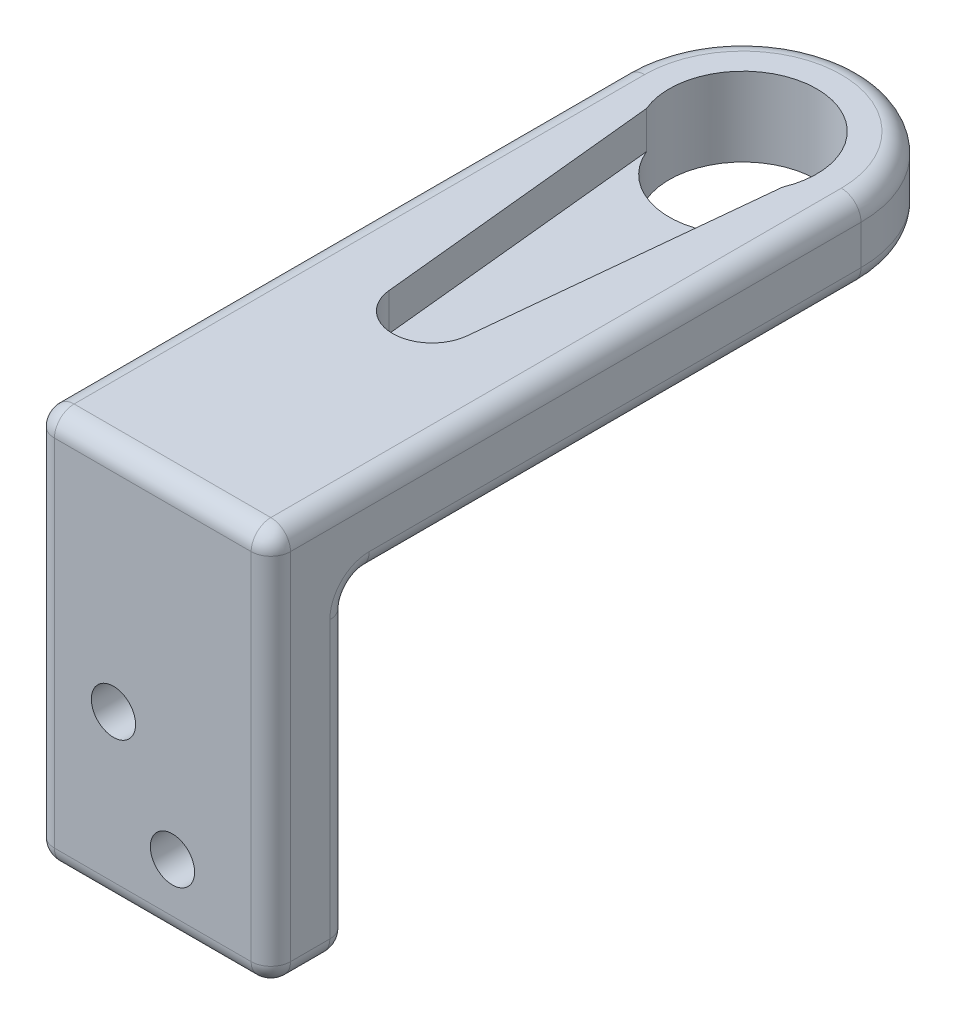
ISO-10303-21;
HEADER;
FILE_DESCRIPTION(('STEP AP214'),'2;1');
FILE_NAME('part.step','',(''),(''),'','','');
FILE_SCHEMA(('AUTOMOTIVE_DESIGN { 1 0 10303 214 1 1 1 1 }'));
ENDSEC;
DATA;
#1=APPLICATION_CONTEXT('core data for automotive mechanical design processes');
#2=APPLICATION_PROTOCOL_DEFINITION('international standard','automotive_design',2000,#1);
#3=PRODUCT_CONTEXT('',#1,'mechanical');
#4=PRODUCT('Part','Part','',(#3));
#5=PRODUCT_RELATED_PRODUCT_CATEGORY('part','',(#4));
#6=PRODUCT_DEFINITION_FORMATION('','',#4);
#7=PRODUCT_DEFINITION_CONTEXT('part definition',#1,'design');
#8=PRODUCT_DEFINITION('design','',#6,#7);
#9=PRODUCT_DEFINITION_SHAPE('','',#8);
#10=(LENGTH_UNIT() NAMED_UNIT(*) SI_UNIT(.MILLI.,.METRE.));
#11=(NAMED_UNIT(*) PLANE_ANGLE_UNIT() SI_UNIT($,.RADIAN.));
#12=(NAMED_UNIT(*) SI_UNIT($,.STERADIAN.) SOLID_ANGLE_UNIT());
#13=UNCERTAINTY_MEASURE_WITH_UNIT(LENGTH_MEASURE(1.E-05),#10,'distance_accuracy_value','');
#14=(GEOMETRIC_REPRESENTATION_CONTEXT(3) GLOBAL_UNCERTAINTY_ASSIGNED_CONTEXT((#13)) GLOBAL_UNIT_ASSIGNED_CONTEXT((#10,
#11,#12)) REPRESENTATION_CONTEXT('',''));
#15=CARTESIAN_POINT('',(0.,0.,0.));
#16=DIRECTION('',(0.,0.,1.));
#17=DIRECTION('',(1.,0.,0.));
#18=AXIS2_PLACEMENT_3D('',#15,#16,#17);
#19=CARTESIAN_POINT('',(0.,4.,0.));
#20=DIRECTION('',(0.,-1.,0.));
#21=DIRECTION('',(0.,0.,-1.));
#22=AXIS2_PLACEMENT_3D('',#19,#20,#21);
#23=CYLINDRICAL_SURFACE('',#22,6.);
#24=DIRECTION('',(0.,-1.,0.));
#25=VECTOR('',#24,1.);
#26=CARTESIAN_POINT('',(-6.,4.,0.));
#27=LINE('',#26,#25);
#28=CARTESIAN_POINT('',(-6.,3.,0.));
#29=VERTEX_POINT('',#28);
#30=CARTESIAN_POINT('',(-6.,1.,0.));
#31=VERTEX_POINT('',#30);
#32=EDGE_CURVE('E234',#29,#31,#27,.T.);
#33=ORIENTED_EDGE('',*,*,#32,.F.);
#34=CARTESIAN_POINT('',(0.,3.,0.));
#35=DIRECTION('',(0.,-1.,0.));
#36=DIRECTION('',(0.,0.,-1.));
#37=AXIS2_PLACEMENT_3D('',#34,#35,#36);
#38=CIRCLE('',#37,6.);
#39=CARTESIAN_POINT('',(6.,3.,0.));
#40=VERTEX_POINT('',#39);
#41=EDGE_CURVE('E306',#29,#40,#38,.T.);
#42=ORIENTED_EDGE('',*,*,#41,.T.);
#43=DIRECTION('',(0.,-1.,0.));
#44=VECTOR('',#43,1.);
#45=CARTESIAN_POINT('',(6.,4.,0.));
#46=LINE('',#45,#44);
#47=CARTESIAN_POINT('',(6.,1.,0.));
#48=VERTEX_POINT('',#47);
#49=EDGE_CURVE('E225',#40,#48,#46,.T.);
#50=ORIENTED_EDGE('',*,*,#49,.T.);
#51=CARTESIAN_POINT('',(0.,1.,0.));
#52=DIRECTION('',(0.,-1.,0.));
#53=DIRECTION('',(0.,0.,-1.));
#54=AXIS2_PLACEMENT_3D('',#51,#52,#53);
#55=CIRCLE('',#54,6.);
#56=EDGE_CURVE('E303',#48,#31,#55,.F.);
#57=ORIENTED_EDGE('',*,*,#56,.T.);
#58=EDGE_LOOP('',(#33,#42,#50,#57));
#59=FACE_BOUND('',#58,.T.);
#60=ADVANCED_FACE('F43',(#59),#23,.T.);
#61=CARTESIAN_POINT('',(-6.,4.,0.));
#62=DIRECTION('',(1.,0.,0.));
#63=DIRECTION('',(0.,0.,-1.));
#64=AXIS2_PLACEMENT_3D('',#61,#62,#63);
#65=PLANE('',#64);
#66=DIRECTION('',(0.,-1.,0.));
#67=VECTOR('',#66,1.);
#68=CARTESIAN_POINT('',(-6.,4.,29.));
#69=LINE('',#68,#67);
#70=CARTESIAN_POINT('',(-6.,-15.05,29.));
#71=VERTEX_POINT('',#70);
#72=CARTESIAN_POINT('',(-6.,3.,29.));
#73=VERTEX_POINT('',#72);
#74=EDGE_CURVE('E284',#71,#73,#69,.F.);
#75=ORIENTED_EDGE('',*,*,#74,.T.);
#76=DIRECTION('',(0.,0.,1.));
#77=VECTOR('',#76,1.);
#78=CARTESIAN_POINT('',(-6.,3.,0.));
#79=LINE('',#78,#77);
#80=EDGE_CURVE('E287',#73,#29,#79,.F.);
#81=ORIENTED_EDGE('',*,*,#80,.T.);
#82=ORIENTED_EDGE('',*,*,#32,.T.);
#83=DIRECTION('',(0.,0.,1.));
#84=VECTOR('',#83,1.);
#85=CARTESIAN_POINT('',(-6.,1.,26.));
#86=LINE('',#85,#84);
#87=CARTESIAN_POINT('',(-6.,1.,25.));
#88=VERTEX_POINT('',#87);
#89=EDGE_CURVE('E275',#31,#88,#86,.T.);
#90=ORIENTED_EDGE('',*,*,#89,.T.);
#91=CARTESIAN_POINT('',(-6.,-1.,25.));
#92=DIRECTION('',(1.,0.,0.));
#93=DIRECTION('',(0.,0.,-1.));
#94=AXIS2_PLACEMENT_3D('',#91,#92,#93);
#95=CIRCLE('',#94,2.);
#96=CARTESIAN_POINT('',(-6.,-1.,27.));
#97=VERTEX_POINT('',#96);
#98=EDGE_CURVE('E271',#97,#88,#95,.F.);
#99=ORIENTED_EDGE('',*,*,#98,.F.);
#100=DIRECTION('',(0.,1.,0.));
#101=VECTOR('',#100,1.);
#102=CARTESIAN_POINT('',(-6.,4.,27.));
#103=LINE('',#102,#101);
#104=CARTESIAN_POINT('',(-6.,-15.05,27.));
#105=VERTEX_POINT('',#104);
#106=EDGE_CURVE('E278',#97,#105,#103,.F.);
#107=ORIENTED_EDGE('',*,*,#106,.T.);
#108=DIRECTION('',(0.,0.,-1.));
#109=VECTOR('',#108,1.);
#110=CARTESIAN_POINT('',(-6.,-15.05,30.));
#111=LINE('',#110,#109);
#112=EDGE_CURVE('E281',#105,#71,#111,.F.);
#113=ORIENTED_EDGE('',*,*,#112,.T.);
#114=EDGE_LOOP('',(#75,#81,#82,#90,#99,#107,#113));
#115=FACE_BOUND('',#114,.T.);
#116=ADVANCED_FACE('F506',(#115),#65,.F.);
#117=CARTESIAN_POINT('',(-6.,4.,30.));
#118=DIRECTION('',(0.,0.,-1.));
#119=DIRECTION('',(-1.,0.,0.));
#120=AXIS2_PLACEMENT_3D('',#117,#118,#119);
#121=PLANE('',#120);
#122=DIRECTION('',(0.,-1.,0.));
#123=VECTOR('',#122,1.);
#124=CARTESIAN_POINT('',(5.,4.,30.));
#125=LINE('',#124,#123);
#126=CARTESIAN_POINT('',(5.,-15.05,30.));
#127=VERTEX_POINT('',#126);
#128=CARTESIAN_POINT('',(5.,3.,30.));
#129=VERTEX_POINT('',#128);
#130=EDGE_CURVE('E328',#127,#129,#125,.F.);
#131=ORIENTED_EDGE('',*,*,#130,.T.);
#132=DIRECTION('',(1.,0.,0.));
#133=VECTOR('',#132,1.);
#134=CARTESIAN_POINT('',(-6.,3.,30.));
#135=LINE('',#134,#133);
#136=CARTESIAN_POINT('',(-5.,3.,30.));
#137=VERTEX_POINT('',#136);
#138=EDGE_CURVE('E331',#129,#137,#135,.F.);
#139=ORIENTED_EDGE('',*,*,#138,.T.);
#140=DIRECTION('',(0.,-1.,0.));
#141=VECTOR('',#140,1.);
#142=CARTESIAN_POINT('',(-5.,4.,30.));
#143=LINE('',#142,#141);
#144=CARTESIAN_POINT('',(-5.,-15.05,30.));
#145=VERTEX_POINT('',#144);
#146=EDGE_CURVE('E325',#137,#145,#143,.T.);
#147=ORIENTED_EDGE('',*,*,#146,.T.);
#148=DIRECTION('',(-1.,0.,0.));
#149=VECTOR('',#148,1.);
#150=CARTESIAN_POINT('',(6.,-15.05,30.));
#151=LINE('',#150,#149);
#152=EDGE_CURVE('E322',#145,#127,#151,.F.);
#153=ORIENTED_EDGE('',*,*,#152,.T.);
#154=EDGE_LOOP('',(#131,#139,#147,#153));
#155=FACE_BOUND('',#154,.T.);
#156=CARTESIAN_POINT('',(1.,-12.55,30.));
#157=DIRECTION('',(0.,0.,-1.));
#158=DIRECTION('',(-1.,0.,0.));
#159=AXIS2_PLACEMENT_3D('',#156,#157,#158);
#160=CIRCLE('',#159,1.125);
#161=CARTESIAN_POINT('',(-0.124999999999997,-12.55,30.));
#162=VERTEX_POINT('',#161);
#163=EDGE_CURVE('E466',#162,#162,#160,.F.);
#164=ORIENTED_EDGE('',*,*,#163,.F.);
#165=EDGE_LOOP('',(#164));
#166=FACE_BOUND('',#165,.T.);
#167=CARTESIAN_POINT('',(-2.,-7.55,30.));
#168=DIRECTION('',(0.,0.,-1.));
#169=DIRECTION('',(-1.,0.,0.));
#170=AXIS2_PLACEMENT_3D('',#167,#168,#169);
#171=CIRCLE('',#170,1.12500000000001);
#172=CARTESIAN_POINT('',(-3.125,-7.55,30.));
#173=VERTEX_POINT('',#172);
#174=EDGE_CURVE('E450',#173,#173,#171,.F.);
#175=ORIENTED_EDGE('',*,*,#174,.F.);
#176=EDGE_LOOP('',(#175));
#177=FACE_BOUND('',#176,.T.);
#178=ADVANCED_FACE('F501',(#155,#166,#177),#121,.F.);
#179=CARTESIAN_POINT('',(6.,4.,30.));
#180=DIRECTION('',(-1.,0.,0.));
#181=DIRECTION('',(0.,0.,1.));
#182=AXIS2_PLACEMENT_3D('',#179,#180,#181);
#183=PLANE('',#182);
#184=CARTESIAN_POINT('',(6.,-1.,25.));
#185=DIRECTION('',(-1.,0.,0.));
#186=DIRECTION('',(0.,0.,1.));
#187=AXIS2_PLACEMENT_3D('',#184,#185,#186);
#188=CIRCLE('',#187,2.);
#189=CARTESIAN_POINT('',(6.,1.,25.));
#190=VERTEX_POINT('',#189);
#191=CARTESIAN_POINT('',(6.,-1.,27.));
#192=VERTEX_POINT('',#191);
#193=EDGE_CURVE('E251',#190,#192,#188,.F.);
#194=ORIENTED_EDGE('',*,*,#193,.F.);
#195=DIRECTION('',(0.,0.,-1.));
#196=VECTOR('',#195,1.);
#197=CARTESIAN_POINT('',(6.,1.,0.));
#198=LINE('',#197,#196);
#199=EDGE_CURVE('E255',#190,#48,#198,.T.);
#200=ORIENTED_EDGE('',*,*,#199,.T.);
#201=ORIENTED_EDGE('',*,*,#49,.F.);
#202=DIRECTION('',(0.,0.,-1.));
#203=VECTOR('',#202,1.);
#204=CARTESIAN_POINT('',(6.,3.,30.));
#205=LINE('',#204,#203);
#206=CARTESIAN_POINT('',(6.,3.,29.));
#207=VERTEX_POINT('',#206);
#208=EDGE_CURVE('E244',#40,#207,#205,.F.);
#209=ORIENTED_EDGE('',*,*,#208,.T.);
#210=DIRECTION('',(0.,-1.,0.));
#211=VECTOR('',#210,1.);
#212=CARTESIAN_POINT('',(6.,4.,29.));
#213=LINE('',#212,#211);
#214=CARTESIAN_POINT('',(6.,-15.05,29.));
#215=VERTEX_POINT('',#214);
#216=EDGE_CURVE('E241',#207,#215,#213,.T.);
#217=ORIENTED_EDGE('',*,*,#216,.T.);
#218=DIRECTION('',(0.,0.,1.));
#219=VECTOR('',#218,1.);
#220=CARTESIAN_POINT('',(6.,-15.05,26.));
#221=LINE('',#220,#219);
#222=CARTESIAN_POINT('',(6.,-15.05,27.));
#223=VERTEX_POINT('',#222);
#224=EDGE_CURVE('E238',#215,#223,#221,.F.);
#225=ORIENTED_EDGE('',*,*,#224,.T.);
#226=DIRECTION('',(0.,1.,0.));
#227=VECTOR('',#226,1.);
#228=CARTESIAN_POINT('',(6.,4.,27.));
#229=LINE('',#228,#227);
#230=EDGE_CURVE('E247',#223,#192,#229,.T.);
#231=ORIENTED_EDGE('',*,*,#230,.T.);
#232=EDGE_LOOP('',(#194,#200,#201,#209,#217,#225,#231));
#233=FACE_BOUND('',#232,.T.);
#234=ADVANCED_FACE('F492',(#233),#183,.F.);
#235=CARTESIAN_POINT('',(0.,4.,0.));
#236=DIRECTION('',(0.,-1.,0.));
#237=DIRECTION('',(0.,0.,-1.));
#238=AXIS2_PLACEMENT_3D('',#235,#236,#237);
#239=PLANE('',#238);
#240=DIRECTION('',(1.,0.,0.));
#241=VECTOR('',#240,1.);
#242=CARTESIAN_POINT('',(0.,4.,29.));
#243=LINE('',#242,#241);
#244=CARTESIAN_POINT('',(-5.,4.,29.));
#245=VERTEX_POINT('',#244);
#246=CARTESIAN_POINT('',(5.,4.,29.));
#247=VERTEX_POINT('',#246);
#248=EDGE_CURVE('E293',#245,#247,#243,.T.);
#249=ORIENTED_EDGE('',*,*,#248,.T.);
#250=DIRECTION('',(0.,0.,-1.));
#251=VECTOR('',#250,1.);
#252=CARTESIAN_POINT('',(5.,4.,0.));
#253=LINE('',#252,#251);
#254=CARTESIAN_POINT('',(5.,4.,0.));
#255=VERTEX_POINT('',#254);
#256=EDGE_CURVE('E299',#247,#255,#253,.T.);
#257=ORIENTED_EDGE('',*,*,#256,.T.);
#258=CARTESIAN_POINT('',(0.,4.,0.));
#259=DIRECTION('',(0.,-1.,0.));
#260=DIRECTION('',(0.,0.,-1.));
#261=AXIS2_PLACEMENT_3D('',#258,#259,#260);
#262=CIRCLE('',#261,5.);
#263=CARTESIAN_POINT('',(-5.,4.,0.));
#264=VERTEX_POINT('',#263);
#265=EDGE_CURVE('E296',#255,#264,#262,.F.);
#266=ORIENTED_EDGE('',*,*,#265,.T.);
#267=DIRECTION('',(0.,0.,1.));
#268=VECTOR('',#267,1.);
#269=CARTESIAN_POINT('',(-5.,4.,0.));
#270=LINE('',#269,#268);
#271=EDGE_CURVE('E290',#264,#245,#270,.T.);
#272=ORIENTED_EDGE('',*,*,#271,.T.);
#273=EDGE_LOOP('',(#249,#257,#266,#272));
#274=FACE_BOUND('',#273,.T.);
#275=CARTESIAN_POINT('',(0.,4.,0.));
#276=DIRECTION('',(0.,1.,0.));
#277=DIRECTION('',(0.,0.,1.));
#278=AXIS2_PLACEMENT_3D('',#275,#276,#277);
#279=CIRCLE('',#278,3.75);
#280=CARTESIAN_POINT('',(3.45999999999994,4.,1.4459944674861));
#281=VERTEX_POINT('',#280);
#282=CARTESIAN_POINT('',(-3.46,4.,1.44599446748596));
#283=VERTEX_POINT('',#282);
#284=EDGE_CURVE('E213',#281,#283,#279,.T.);
#285=ORIENTED_EDGE('',*,*,#284,.F.);
#286=DIRECTION('',(0.1004588297189,0.,-0.994941216118575));
#287=VECTOR('',#286,1.);
#288=CARTESIAN_POINT('',(3.45999999999994,4.,1.4459944674861));
#289=LINE('',#288,#287);
#290=CARTESIAN_POINT('',(1.98988243223717,4.,16.0059944674861));
#291=VERTEX_POINT('',#290);
#292=EDGE_CURVE('E208',#291,#281,#289,.T.);
#293=ORIENTED_EDGE('',*,*,#292,.F.);
#294=CARTESIAN_POINT('',(0.,4.,15.8050768080483));
#295=DIRECTION('',(0.,1.,0.));
#296=DIRECTION('',(0.,0.,1.));
#297=AXIS2_PLACEMENT_3D('',#294,#295,#296);
#298=CIRCLE('',#297,2.00000000000002);
#299=CARTESIAN_POINT('',(-1.98988243223721,4.,16.005994467486));
#300=VERTEX_POINT('',#299);
#301=EDGE_CURVE('E474',#300,#291,#298,.T.);
#302=ORIENTED_EDGE('',*,*,#301,.F.);
#303=DIRECTION('',(0.100458829718901,0.,0.994941216118575));
#304=VECTOR('',#303,1.);
#305=CARTESIAN_POINT('',(-3.46,4.,1.44599446748596));
#306=LINE('',#305,#304);
#307=EDGE_CURVE('E471',#283,#300,#306,.T.);
#308=ORIENTED_EDGE('',*,*,#307,.F.);
#309=EDGE_LOOP('',(#285,#293,#302,#308));
#310=FACE_BOUND('',#309,.T.);
#311=ADVANCED_FACE('F489',(#274,#310),#239,.F.);
#312=CARTESIAN_POINT('',(0.,0.,0.));
#313=DIRECTION('',(0.,-1.,0.));
#314=DIRECTION('',(0.,0.,-1.));
#315=AXIS2_PLACEMENT_3D('',#312,#313,#314);
#316=PLANE('',#315);
#317=CARTESIAN_POINT('',(0.,0.,0.));
#318=DIRECTION('',(0.,-1.,0.));
#319=DIRECTION('',(0.,0.,-1.));
#320=AXIS2_PLACEMENT_3D('',#317,#318,#319);
#321=CIRCLE('',#320,5.);
#322=CARTESIAN_POINT('',(-5.,0.,0.));
#323=VERTEX_POINT('',#322);
#324=CARTESIAN_POINT('',(5.,0.,0.));
#325=VERTEX_POINT('',#324);
#326=EDGE_CURVE('E315',#323,#325,#321,.T.);
#327=ORIENTED_EDGE('',*,*,#326,.T.);
#328=DIRECTION('',(0.,0.,-1.));
#329=VECTOR('',#328,1.);
#330=CARTESIAN_POINT('',(5.,0.,26.));
#331=LINE('',#330,#329);
#332=CARTESIAN_POINT('',(5.,0.,25.));
#333=VERTEX_POINT('',#332);
#334=EDGE_CURVE('E318',#325,#333,#331,.F.);
#335=ORIENTED_EDGE('',*,*,#334,.T.);
#336=DIRECTION('',(1.,0.,0.));
#337=VECTOR('',#336,1.);
#338=CARTESIAN_POINT('',(0.,0.,25.));
#339=LINE('',#338,#337);
#340=CARTESIAN_POINT('',(-5.,0.,25.));
#341=VERTEX_POINT('',#340);
#342=EDGE_CURVE('E309',#333,#341,#339,.F.);
#343=ORIENTED_EDGE('',*,*,#342,.T.);
#344=DIRECTION('',(0.,0.,1.));
#345=VECTOR('',#344,1.);
#346=CARTESIAN_POINT('',(-5.,0.,0.));
#347=LINE('',#346,#345);
#348=EDGE_CURVE('E312',#341,#323,#347,.F.);
#349=ORIENTED_EDGE('',*,*,#348,.T.);
#350=EDGE_LOOP('',(#327,#335,#343,#349));
#351=FACE_BOUND('',#350,.T.);
#352=CARTESIAN_POINT('',(0.,0.,0.));
#353=DIRECTION('',(0.,-1.,0.));
#354=DIRECTION('',(0.,0.,-1.));
#355=AXIS2_PLACEMENT_3D('',#352,#353,#354);
#356=CIRCLE('',#355,3.75);
#357=CARTESIAN_POINT('',(0.,0.,-3.75));
#358=VERTEX_POINT('',#357);
#359=EDGE_CURVE('E226',#358,#358,#356,.F.);
#360=ORIENTED_EDGE('',*,*,#359,.T.);
#361=EDGE_LOOP('',(#360));
#362=FACE_BOUND('',#361,.T.);
#363=ADVANCED_FACE('F491',(#351,#362),#316,.T.);
#364=CARTESIAN_POINT('',(0.,-0.00100000000000013,0.));
#365=DIRECTION('',(0.,1.,0.));
#366=DIRECTION('',(0.,0.,1.));
#367=AXIS2_PLACEMENT_3D('',#364,#365,#366);
#368=CYLINDRICAL_SURFACE('',#367,3.75);
#369=ORIENTED_EDGE('',*,*,#359,.F.);
#370=EDGE_LOOP('',(#369));
#371=FACE_BOUND('',#370,.T.);
#372=CARTESIAN_POINT('',(0.,2.1,0.));
#373=DIRECTION('',(0.,-1.,0.));
#374=DIRECTION('',(0.,0.,1.));
#375=AXIS2_PLACEMENT_3D('',#372,#373,#374);
#376=CIRCLE('',#375,3.75);
#377=CARTESIAN_POINT('',(3.45999999999994,2.1,1.4459944674861));
#378=VERTEX_POINT('',#377);
#379=CARTESIAN_POINT('',(-3.46,2.1,1.44599446748596));
#380=VERTEX_POINT('',#379);
#381=EDGE_CURVE('E198',#378,#380,#376,.T.);
#382=ORIENTED_EDGE('',*,*,#381,.F.);
#383=DIRECTION('',(0.,1.,0.));
#384=VECTOR('',#383,1.);
#385=CARTESIAN_POINT('',(3.45999999999994,2.1,1.4459944674861));
#386=LINE('',#385,#384);
#387=EDGE_CURVE('E230',#378,#281,#386,.T.);
#388=ORIENTED_EDGE('',*,*,#387,.T.);
#389=ORIENTED_EDGE('',*,*,#284,.T.);
#390=DIRECTION('',(0.,1.,0.));
#391=VECTOR('',#390,1.);
#392=CARTESIAN_POINT('',(-3.46,2.1,1.44599446748596));
#393=LINE('',#392,#391);
#394=EDGE_CURVE('E190',#380,#283,#393,.T.);
#395=ORIENTED_EDGE('',*,*,#394,.F.);
#396=EDGE_LOOP('',(#382,#388,#389,#395));
#397=FACE_BOUND('',#396,.T.);
#398=ADVANCED_FACE('F211',(#371,#397),#368,.F.);
#399=CARTESIAN_POINT('',(3.45999999999994,2.1,1.4459944674861));
#400=DIRECTION('',(0.994941216118575,0.,0.1004588297189));
#401=DIRECTION('',(0.1004588297189,0.,-0.994941216118575));
#402=AXIS2_PLACEMENT_3D('',#399,#400,#401);
#403=PLANE('',#402);
#404=ORIENTED_EDGE('',*,*,#292,.T.);
#405=ORIENTED_EDGE('',*,*,#387,.F.);
#406=DIRECTION('',(0.1004588297189,0.,-0.994941216118575));
#407=VECTOR('',#406,1.);
#408=CARTESIAN_POINT('',(3.45999999999994,2.1,1.4459944674861));
#409=LINE('',#408,#407);
#410=CARTESIAN_POINT('',(1.98988243223717,2.1,16.0059944674861));
#411=VERTEX_POINT('',#410);
#412=EDGE_CURVE('E203',#411,#378,#409,.T.);
#413=ORIENTED_EDGE('',*,*,#412,.F.);
#414=DIRECTION('',(0.,1.,0.));
#415=VECTOR('',#414,1.);
#416=CARTESIAN_POINT('',(1.98988243223717,2.1,16.0059944674861));
#417=LINE('',#416,#415);
#418=EDGE_CURVE('E218',#411,#291,#417,.T.);
#419=ORIENTED_EDGE('',*,*,#418,.T.);
#420=EDGE_LOOP('',(#404,#405,#413,#419));
#421=FACE_BOUND('',#420,.T.);
#422=ADVANCED_FACE('F483',(#421),#403,.F.);
#423=CARTESIAN_POINT('',(0.,2.1,15.8050768080483));
#424=DIRECTION('',(0.,1.,0.));
#425=DIRECTION('',(0.,0.,1.));
#426=AXIS2_PLACEMENT_3D('',#423,#424,#425);
#427=CYLINDRICAL_SURFACE('',#426,2.00000000000002);
#428=ORIENTED_EDGE('',*,*,#301,.T.);
#429=ORIENTED_EDGE('',*,*,#418,.F.);
#430=CARTESIAN_POINT('',(0.,2.1,15.8050768080483));
#431=DIRECTION('',(0.,1.,0.));
#432=DIRECTION('',(0.,0.,1.));
#433=AXIS2_PLACEMENT_3D('',#430,#431,#432);
#434=CIRCLE('',#433,2.00000000000002);
#435=CARTESIAN_POINT('',(-1.98988243223721,2.1,16.005994467486));
#436=VERTEX_POINT('',#435);
#437=EDGE_CURVE('E197',#436,#411,#434,.T.);
#438=ORIENTED_EDGE('',*,*,#437,.F.);
#439=DIRECTION('',(0.,1.,0.));
#440=VECTOR('',#439,1.);
#441=CARTESIAN_POINT('',(-1.98988243223721,2.1,16.005994467486));
#442=LINE('',#441,#440);
#443=EDGE_CURVE('E192',#436,#300,#442,.T.);
#444=ORIENTED_EDGE('',*,*,#443,.T.);
#445=EDGE_LOOP('',(#428,#429,#438,#444));
#446=FACE_BOUND('',#445,.T.);
#447=ADVANCED_FACE('F487',(#446),#427,.F.);
#448=CARTESIAN_POINT('',(-3.46,2.1,1.44599446748596));
#449=DIRECTION('',(-0.994941216118575,0.,0.100458829718901));
#450=DIRECTION('',(0.100458829718901,0.,0.994941216118575));
#451=AXIS2_PLACEMENT_3D('',#448,#449,#450);
#452=PLANE('',#451);
#453=ORIENTED_EDGE('',*,*,#307,.T.);
#454=ORIENTED_EDGE('',*,*,#443,.F.);
#455=DIRECTION('',(0.100458829718901,0.,0.994941216118575));
#456=VECTOR('',#455,1.);
#457=CARTESIAN_POINT('',(-3.46,2.1,1.44599446748596));
#458=LINE('',#457,#456);
#459=EDGE_CURVE('E185',#380,#436,#458,.T.);
#460=ORIENTED_EDGE('',*,*,#459,.F.);
#461=ORIENTED_EDGE('',*,*,#394,.T.);
#462=EDGE_LOOP('',(#453,#454,#460,#461));
#463=FACE_BOUND('',#462,.T.);
#464=ADVANCED_FACE('F188',(#463),#452,.F.);
#465=CARTESIAN_POINT('',(0.,2.1,0.));
#466=DIRECTION('',(0.,1.,0.));
#467=DIRECTION('',(0.,0.,1.));
#468=AXIS2_PLACEMENT_3D('',#465,#466,#467);
#469=PLANE('',#468);
#470=ORIENTED_EDGE('',*,*,#381,.T.);
#471=ORIENTED_EDGE('',*,*,#459,.T.);
#472=ORIENTED_EDGE('',*,*,#437,.T.);
#473=ORIENTED_EDGE('',*,*,#412,.T.);
#474=EDGE_LOOP('',(#470,#471,#472,#473));
#475=FACE_BOUND('',#474,.T.);
#476=ADVANCED_FACE('F201',(#475),#469,.T.);
#477=CARTESIAN_POINT('',(-5.99999999999999,-16.05,26.));
#478=DIRECTION('',(0.,0.,1.));
#479=DIRECTION('',(1.,0.,0.));
#480=AXIS2_PLACEMENT_3D('',#477,#478,#479);
#481=PLANE('',#480);
#482=DIRECTION('',(0.,1.,0.));
#483=VECTOR('',#482,1.);
#484=CARTESIAN_POINT('',(5.,-16.05,26.));
#485=LINE('',#484,#483);
#486=CARTESIAN_POINT('',(5.,-1.,26.));
#487=VERTEX_POINT('',#486);
#488=CARTESIAN_POINT('',(5.,-15.05,26.));
#489=VERTEX_POINT('',#488);
#490=EDGE_CURVE('E264',#487,#489,#485,.F.);
#491=ORIENTED_EDGE('',*,*,#490,.T.);
#492=DIRECTION('',(1.,0.,0.));
#493=VECTOR('',#492,1.);
#494=CARTESIAN_POINT('',(-5.99999999999999,-15.05,26.));
#495=LINE('',#494,#493);
#496=CARTESIAN_POINT('',(-5.,-15.05,26.));
#497=VERTEX_POINT('',#496);
#498=EDGE_CURVE('E268',#489,#497,#495,.F.);
#499=ORIENTED_EDGE('',*,*,#498,.T.);
#500=DIRECTION('',(0.,1.,0.));
#501=VECTOR('',#500,1.);
#502=CARTESIAN_POINT('',(-5.,-16.05,26.));
#503=LINE('',#502,#501);
#504=CARTESIAN_POINT('',(-5.,-1.,26.));
#505=VERTEX_POINT('',#504);
#506=EDGE_CURVE('E261',#497,#505,#503,.T.);
#507=ORIENTED_EDGE('',*,*,#506,.T.);
#508=DIRECTION('',(1.,0.,0.));
#509=VECTOR('',#508,1.);
#510=CARTESIAN_POINT('',(-5.99999999999999,-1.,26.));
#511=LINE('',#510,#509);
#512=EDGE_CURVE('E258',#505,#487,#511,.T.);
#513=ORIENTED_EDGE('',*,*,#512,.T.);
#514=EDGE_LOOP('',(#491,#499,#507,#513));
#515=FACE_BOUND('',#514,.T.);
#516=CARTESIAN_POINT('',(1.,-12.55,26.));
#517=DIRECTION('',(0.,0.,-1.));
#518=DIRECTION('',(-1.,0.,0.));
#519=AXIS2_PLACEMENT_3D('',#516,#517,#518);
#520=CIRCLE('',#519,1.125);
#521=CARTESIAN_POINT('',(-0.124999999999997,-12.55,26.));
#522=VERTEX_POINT('',#521);
#523=EDGE_CURVE('E463',#522,#522,#520,.T.);
#524=ORIENTED_EDGE('',*,*,#523,.F.);
#525=EDGE_LOOP('',(#524));
#526=FACE_BOUND('',#525,.T.);
#527=CARTESIAN_POINT('',(-2.,-7.55,26.));
#528=DIRECTION('',(0.,0.,-1.));
#529=DIRECTION('',(-1.,0.,0.));
#530=AXIS2_PLACEMENT_3D('',#527,#528,#529);
#531=CIRCLE('',#530,1.12500000000001);
#532=CARTESIAN_POINT('',(-3.125,-7.55,26.));
#533=VERTEX_POINT('',#532);
#534=EDGE_CURVE('E457',#533,#533,#531,.T.);
#535=ORIENTED_EDGE('',*,*,#534,.F.);
#536=EDGE_LOOP('',(#535));
#537=FACE_BOUND('',#536,.T.);
#538=ADVANCED_FACE('F644',(#515,#526,#537),#481,.F.);
#539=CARTESIAN_POINT('',(0.,-16.05,0.));
#540=DIRECTION('',(0.,-1.,0.));
#541=DIRECTION('',(0.,0.,-1.));
#542=AXIS2_PLACEMENT_3D('',#539,#540,#541);
#543=PLANE('',#542);
#544=DIRECTION('',(0.,0.,1.));
#545=VECTOR('',#544,1.);
#546=CARTESIAN_POINT('',(5.,-16.05,30.));
#547=LINE('',#546,#545);
#548=CARTESIAN_POINT('',(5.,-16.05,27.));
#549=VERTEX_POINT('',#548);
#550=CARTESIAN_POINT('',(5.,-16.05,29.));
#551=VERTEX_POINT('',#550);
#552=EDGE_CURVE('E53',#549,#551,#547,.T.);
#553=ORIENTED_EDGE('',*,*,#552,.T.);
#554=DIRECTION('',(-1.,0.,0.));
#555=VECTOR('',#554,1.);
#556=CARTESIAN_POINT('',(-6.,-16.05,29.));
#557=LINE('',#556,#555);
#558=CARTESIAN_POINT('',(-5.,-16.05,29.));
#559=VERTEX_POINT('',#558);
#560=EDGE_CURVE('E11',#551,#559,#557,.T.);
#561=ORIENTED_EDGE('',*,*,#560,.T.);
#562=DIRECTION('',(0.,0.,-1.));
#563=VECTOR('',#562,1.);
#564=CARTESIAN_POINT('',(-5.,-16.05,26.));
#565=LINE('',#564,#563);
#566=CARTESIAN_POINT('',(-5.,-16.05,27.));
#567=VERTEX_POINT('',#566);
#568=EDGE_CURVE('E335',#559,#567,#565,.T.);
#569=ORIENTED_EDGE('',*,*,#568,.T.);
#570=DIRECTION('',(1.,0.,0.));
#571=VECTOR('',#570,1.);
#572=CARTESIAN_POINT('',(6.,-16.05,27.));
#573=LINE('',#572,#571);
#574=EDGE_CURVE('E64',#567,#549,#573,.T.);
#575=ORIENTED_EDGE('',*,*,#574,.T.);
#576=EDGE_LOOP('',(#553,#561,#569,#575));
#577=FACE_BOUND('',#576,.T.);
#578=ADVANCED_FACE('F659',(#577),#543,.T.);
#579=CARTESIAN_POINT('',(-2.,-7.55,30.001));
#580=DIRECTION('',(0.,0.,-1.));
#581=DIRECTION('',(-1.,0.,0.));
#582=AXIS2_PLACEMENT_3D('',#579,#580,#581);
#583=CYLINDRICAL_SURFACE('',#582,1.12500000000001);
#584=ORIENTED_EDGE('',*,*,#534,.T.);
#585=EDGE_LOOP('',(#584));
#586=FACE_BOUND('',#585,.T.);
#587=ORIENTED_EDGE('',*,*,#174,.T.);
#588=EDGE_LOOP('',(#587));
#589=FACE_BOUND('',#588,.T.);
#590=ADVANCED_FACE('F682',(#586,#589),#583,.F.);
#591=CARTESIAN_POINT('',(1.,-12.55,30.001));
#592=DIRECTION('',(0.,0.,-1.));
#593=DIRECTION('',(-1.,0.,0.));
#594=AXIS2_PLACEMENT_3D('',#591,#592,#593);
#595=CYLINDRICAL_SURFACE('',#594,1.125);
#596=ORIENTED_EDGE('',*,*,#523,.T.);
#597=EDGE_LOOP('',(#596));
#598=FACE_BOUND('',#597,.T.);
#599=ORIENTED_EDGE('',*,*,#163,.T.);
#600=EDGE_LOOP('',(#599));
#601=FACE_BOUND('',#600,.T.);
#602=ADVANCED_FACE('F608',(#598,#601),#595,.F.);
#603=CARTESIAN_POINT('',(-5.,3.,0.));
#604=DIRECTION('',(0.,0.,1.));
#605=DIRECTION('',(1.,0.,0.));
#606=AXIS2_PLACEMENT_3D('',#603,#604,#605);
#607=CYLINDRICAL_SURFACE('',#606,1.);
#608=CARTESIAN_POINT('',(-5.,3.,29.));
#609=DIRECTION('',(0.,0.,1.));
#610=DIRECTION('',(1.,0.,0.));
#611=AXIS2_PLACEMENT_3D('',#608,#609,#610);
#612=CIRCLE('',#611,1.);
#613=EDGE_CURVE('E47',#245,#73,#612,.T.);
#614=ORIENTED_EDGE('',*,*,#613,.F.);
#615=ORIENTED_EDGE('',*,*,#271,.F.);
#616=CARTESIAN_POINT('',(-5.,3.,0.));
#617=DIRECTION('',(0.,0.,-1.));
#618=DIRECTION('',(-1.,0.,0.));
#619=AXIS2_PLACEMENT_3D('',#616,#617,#618);
#620=CIRCLE('',#619,1.);
#621=EDGE_CURVE('E441',#29,#264,#620,.T.);
#622=ORIENTED_EDGE('',*,*,#621,.F.);
#623=ORIENTED_EDGE('',*,*,#80,.F.);
#624=EDGE_LOOP('',(#614,#615,#622,#623));
#625=FACE_BOUND('',#624,.T.);
#626=ADVANCED_FACE('F45',(#625),#607,.T.);
#627=CARTESIAN_POINT('',(-5.,3.,29.));
#628=DIRECTION('',(-1.,0.,0.));
#629=DIRECTION('',(0.,0.,1.));
#630=AXIS2_PLACEMENT_3D('',#627,#628,#629);
#631=SPHERICAL_SURFACE('',#630,1.);
#632=CARTESIAN_POINT('',(-5.,3.,29.));
#633=DIRECTION('',(-1.,0.,0.));
#634=DIRECTION('',(0.,0.,1.));
#635=AXIS2_PLACEMENT_3D('',#632,#633,#634);
#636=CIRCLE('',#635,1.);
#637=EDGE_CURVE('E434',#245,#137,#636,.F.);
#638=ORIENTED_EDGE('',*,*,#637,.F.);
#639=ORIENTED_EDGE('',*,*,#613,.T.);
#640=CARTESIAN_POINT('',(-5.,3.,29.));
#641=DIRECTION('',(0.,1.,0.));
#642=DIRECTION('',(0.,0.,1.));
#643=AXIS2_PLACEMENT_3D('',#640,#641,#642);
#644=CIRCLE('',#643,1.);
#645=EDGE_CURVE('E438',#137,#73,#644,.F.);
#646=ORIENTED_EDGE('',*,*,#645,.F.);
#647=EDGE_LOOP('',(#638,#639,#646));
#648=FACE_BOUND('',#647,.T.);
#649=ADVANCED_FACE('F603',(#648),#631,.T.);
#650=CARTESIAN_POINT('',(0.,3.,0.));
#651=DIRECTION('',(0.,-1.,0.));
#652=DIRECTION('',(0.,0.,-1.));
#653=AXIS2_PLACEMENT_3D('',#650,#651,#652);
#654=TOROIDAL_SURFACE('',#653,5.,1.);
#655=ORIENTED_EDGE('',*,*,#621,.T.);
#656=ORIENTED_EDGE('',*,*,#265,.F.);
#657=CARTESIAN_POINT('',(5.,3.,0.));
#658=DIRECTION('',(0.,0.,1.));
#659=DIRECTION('',(1.,0.,0.));
#660=AXIS2_PLACEMENT_3D('',#657,#658,#659);
#661=CIRCLE('',#660,1.);
#662=EDGE_CURVE('E431',#40,#255,#661,.T.);
#663=ORIENTED_EDGE('',*,*,#662,.F.);
#664=ORIENTED_EDGE('',*,*,#41,.F.);
#665=EDGE_LOOP('',(#655,#656,#663,#664));
#666=FACE_BOUND('',#665,.T.);
#667=ADVANCED_FACE('F600',(#666),#654,.T.);
#668=CARTESIAN_POINT('',(-5.,4.,29.));
#669=DIRECTION('',(0.,-1.,0.));
#670=DIRECTION('',(0.,0.,-1.));
#671=AXIS2_PLACEMENT_3D('',#668,#669,#670);
#672=CYLINDRICAL_SURFACE('',#671,1.);
#673=ORIENTED_EDGE('',*,*,#645,.T.);
#674=ORIENTED_EDGE('',*,*,#74,.F.);
#675=CARTESIAN_POINT('',(-5.,-15.05,29.));
#676=DIRECTION('',(0.,-1.,0.));
#677=DIRECTION('',(0.,0.,-1.));
#678=AXIS2_PLACEMENT_3D('',#675,#676,#677);
#679=CIRCLE('',#678,1.);
#680=EDGE_CURVE('E427',#145,#71,#679,.T.);
#681=ORIENTED_EDGE('',*,*,#680,.F.);
#682=ORIENTED_EDGE('',*,*,#146,.F.);
#683=EDGE_LOOP('',(#673,#674,#681,#682));
#684=FACE_BOUND('',#683,.T.);
#685=ADVANCED_FACE('F596',(#684),#672,.T.);
#686=CARTESIAN_POINT('',(0.,3.,29.));
#687=DIRECTION('',(1.,0.,0.));
#688=DIRECTION('',(0.,0.,-1.));
#689=AXIS2_PLACEMENT_3D('',#686,#687,#688);
#690=CYLINDRICAL_SURFACE('',#689,1.);
#691=ORIENTED_EDGE('',*,*,#637,.T.);
#692=ORIENTED_EDGE('',*,*,#138,.F.);
#693=CARTESIAN_POINT('',(5.,3.,29.));
#694=DIRECTION('',(1.,0.,0.));
#695=DIRECTION('',(0.,0.,-1.));
#696=AXIS2_PLACEMENT_3D('',#693,#694,#695);
#697=CIRCLE('',#696,1.);
#698=EDGE_CURVE('E423',#247,#129,#697,.T.);
#699=ORIENTED_EDGE('',*,*,#698,.F.);
#700=ORIENTED_EDGE('',*,*,#248,.F.);
#701=EDGE_LOOP('',(#691,#692,#699,#700));
#702=FACE_BOUND('',#701,.T.);
#703=ADVANCED_FACE('F592',(#702),#690,.T.);
#704=CARTESIAN_POINT('',(5.,3.,0.));
#705=DIRECTION('',(0.,0.,-1.));
#706=DIRECTION('',(-1.,0.,0.));
#707=AXIS2_PLACEMENT_3D('',#704,#705,#706);
#708=CYLINDRICAL_SURFACE('',#707,1.);
#709=ORIENTED_EDGE('',*,*,#662,.T.);
#710=ORIENTED_EDGE('',*,*,#256,.F.);
#711=CARTESIAN_POINT('',(5.,3.,29.));
#712=DIRECTION('',(0.,0.,1.));
#713=DIRECTION('',(1.,0.,0.));
#714=AXIS2_PLACEMENT_3D('',#711,#712,#713);
#715=CIRCLE('',#714,1.);
#716=EDGE_CURVE('E419',#207,#247,#715,.T.);
#717=ORIENTED_EDGE('',*,*,#716,.F.);
#718=ORIENTED_EDGE('',*,*,#208,.F.);
#719=EDGE_LOOP('',(#709,#710,#717,#718));
#720=FACE_BOUND('',#719,.T.);
#721=ADVANCED_FACE('F588',(#720),#708,.T.);
#722=CARTESIAN_POINT('',(-5.,-15.05,29.));
#723=DIRECTION('',(-1.,0.,0.));
#724=DIRECTION('',(0.,0.,1.));
#725=AXIS2_PLACEMENT_3D('',#722,#723,#724);
#726=SPHERICAL_SURFACE('',#725,1.);
#727=CARTESIAN_POINT('',(-5.,-15.05,29.));
#728=DIRECTION('',(-1.,0.,0.));
#729=DIRECTION('',(0.,0.,1.));
#730=AXIS2_PLACEMENT_3D('',#727,#728,#729);
#731=CIRCLE('',#730,1.);
#732=EDGE_CURVE('E411',#145,#559,#731,.F.);
#733=ORIENTED_EDGE('',*,*,#732,.F.);
#734=ORIENTED_EDGE('',*,*,#680,.T.);
#735=CARTESIAN_POINT('',(-5.,-15.05,29.));
#736=DIRECTION('',(0.,0.,1.));
#737=DIRECTION('',(1.,0.,0.));
#738=AXIS2_PLACEMENT_3D('',#735,#736,#737);
#739=CIRCLE('',#738,1.);
#740=EDGE_CURVE('E415',#559,#71,#739,.F.);
#741=ORIENTED_EDGE('',*,*,#740,.F.);
#742=EDGE_LOOP('',(#733,#734,#741));
#743=FACE_BOUND('',#742,.T.);
#744=ADVANCED_FACE('F584',(#743),#726,.T.);
#745=CARTESIAN_POINT('',(5.,3.,29.));
#746=DIRECTION('',(0.,1.,0.));
#747=DIRECTION('',(0.,0.,1.));
#748=AXIS2_PLACEMENT_3D('',#745,#746,#747);
#749=SPHERICAL_SURFACE('',#748,1.);
#750=ORIENTED_EDGE('',*,*,#716,.T.);
#751=ORIENTED_EDGE('',*,*,#698,.T.);
#752=CARTESIAN_POINT('',(5.,3.,29.));
#753=DIRECTION('',(0.,1.,0.));
#754=DIRECTION('',(0.,0.,1.));
#755=AXIS2_PLACEMENT_3D('',#752,#753,#754);
#756=CIRCLE('',#755,1.);
#757=EDGE_CURVE('E407',#207,#129,#756,.F.);
#758=ORIENTED_EDGE('',*,*,#757,.F.);
#759=EDGE_LOOP('',(#750,#751,#758));
#760=FACE_BOUND('',#759,.T.);
#761=ADVANCED_FACE('F580',(#760),#749,.T.);
#762=CARTESIAN_POINT('',(-5.,-15.05,0.));
#763=DIRECTION('',(0.,0.,1.));
#764=DIRECTION('',(1.,0.,0.));
#765=AXIS2_PLACEMENT_3D('',#762,#763,#764);
#766=CYLINDRICAL_SURFACE('',#765,1.);
#767=ORIENTED_EDGE('',*,*,#740,.T.);
#768=ORIENTED_EDGE('',*,*,#112,.F.);
#769=CARTESIAN_POINT('',(-5.,-15.05,27.));
#770=DIRECTION('',(0.,0.,-1.));
#771=DIRECTION('',(-1.,0.,0.));
#772=AXIS2_PLACEMENT_3D('',#769,#770,#771);
#773=CIRCLE('',#772,1.);
#774=EDGE_CURVE('E399',#567,#105,#773,.T.);
#775=ORIENTED_EDGE('',*,*,#774,.F.);
#776=ORIENTED_EDGE('',*,*,#568,.F.);
#777=EDGE_LOOP('',(#767,#768,#775,#776));
#778=FACE_BOUND('',#777,.T.);
#779=ADVANCED_FACE('F576',(#778),#766,.T.);
#780=CARTESIAN_POINT('',(0.,-15.05,29.));
#781=DIRECTION('',(1.,0.,0.));
#782=DIRECTION('',(0.,0.,-1.));
#783=AXIS2_PLACEMENT_3D('',#780,#781,#782);
#784=CYLINDRICAL_SURFACE('',#783,1.);
#785=ORIENTED_EDGE('',*,*,#732,.T.);
#786=ORIENTED_EDGE('',*,*,#560,.F.);
#787=CARTESIAN_POINT('',(5.,-15.05,29.));
#788=DIRECTION('',(1.,0.,0.));
#789=DIRECTION('',(0.,0.,-1.));
#790=AXIS2_PLACEMENT_3D('',#787,#788,#789);
#791=CIRCLE('',#790,1.);
#792=EDGE_CURVE('E395',#127,#551,#791,.T.);
#793=ORIENTED_EDGE('',*,*,#792,.F.);
#794=ORIENTED_EDGE('',*,*,#152,.F.);
#795=EDGE_LOOP('',(#785,#786,#793,#794));
#796=FACE_BOUND('',#795,.T.);
#797=ADVANCED_FACE('F572',(#796),#784,.T.);
#798=CARTESIAN_POINT('',(5.,4.,29.));
#799=DIRECTION('',(0.,-1.,0.));
#800=DIRECTION('',(0.,0.,-1.));
#801=AXIS2_PLACEMENT_3D('',#798,#799,#800);
#802=CYLINDRICAL_SURFACE('',#801,1.);
#803=ORIENTED_EDGE('',*,*,#757,.T.);
#804=ORIENTED_EDGE('',*,*,#130,.F.);
#805=CARTESIAN_POINT('',(5.,-15.05,29.));
#806=DIRECTION('',(0.,-1.,0.));
#807=DIRECTION('',(0.,0.,-1.));
#808=AXIS2_PLACEMENT_3D('',#805,#806,#807);
#809=CIRCLE('',#808,1.);
#810=EDGE_CURVE('E391',#215,#127,#809,.T.);
#811=ORIENTED_EDGE('',*,*,#810,.F.);
#812=ORIENTED_EDGE('',*,*,#216,.F.);
#813=EDGE_LOOP('',(#803,#804,#811,#812));
#814=FACE_BOUND('',#813,.T.);
#815=ADVANCED_FACE('F568',(#814),#802,.T.);
#816=CARTESIAN_POINT('',(-5.,1.,0.));
#817=DIRECTION('',(0.,0.,-1.));
#818=DIRECTION('',(-1.,0.,0.));
#819=AXIS2_PLACEMENT_3D('',#816,#817,#818);
#820=CYLINDRICAL_SURFACE('',#819,1.);
#821=CARTESIAN_POINT('',(-5.,1.,25.));
#822=DIRECTION('',(0.,0.,1.));
#823=DIRECTION('',(1.,0.,0.));
#824=AXIS2_PLACEMENT_3D('',#821,#822,#823);
#825=CIRCLE('',#824,1.);
#826=EDGE_CURVE('E383',#88,#341,#825,.T.);
#827=ORIENTED_EDGE('',*,*,#826,.F.);
#828=ORIENTED_EDGE('',*,*,#89,.F.);
#829=CARTESIAN_POINT('',(-5.,1.,0.));
#830=DIRECTION('',(0.,0.,-1.));
#831=DIRECTION('',(-1.,0.,0.));
#832=AXIS2_PLACEMENT_3D('',#829,#830,#831);
#833=CIRCLE('',#832,1.);
#834=EDGE_CURVE('E387',#323,#31,#833,.T.);
#835=ORIENTED_EDGE('',*,*,#834,.F.);
#836=ORIENTED_EDGE('',*,*,#348,.F.);
#837=EDGE_LOOP('',(#827,#828,#835,#836));
#838=FACE_BOUND('',#837,.T.);
#839=ADVANCED_FACE('F564',(#838),#820,.T.);
#840=CARTESIAN_POINT('',(-5.,-16.05,27.));
#841=DIRECTION('',(0.,1.,0.));
#842=DIRECTION('',(0.,0.,1.));
#843=AXIS2_PLACEMENT_3D('',#840,#841,#842);
#844=CYLINDRICAL_SURFACE('',#843,1.);
#845=CARTESIAN_POINT('',(-5.,-15.05,27.));
#846=DIRECTION('',(0.,-1.,0.));
#847=DIRECTION('',(0.,0.,-1.));
#848=AXIS2_PLACEMENT_3D('',#845,#846,#847);
#849=CIRCLE('',#848,1.);
#850=EDGE_CURVE('E403',#105,#497,#849,.T.);
#851=ORIENTED_EDGE('',*,*,#850,.F.);
#852=ORIENTED_EDGE('',*,*,#106,.F.);
#853=CARTESIAN_POINT('',(-5.,-1.,27.));
#854=DIRECTION('',(0.,1.,0.));
#855=DIRECTION('',(0.,0.,1.));
#856=AXIS2_PLACEMENT_3D('',#853,#854,#855);
#857=CIRCLE('',#856,1.);
#858=EDGE_CURVE('E379',#505,#97,#857,.T.);
#859=ORIENTED_EDGE('',*,*,#858,.F.);
#860=ORIENTED_EDGE('',*,*,#506,.F.);
#861=EDGE_LOOP('',(#851,#852,#859,#860));
#862=FACE_BOUND('',#861,.T.);
#863=ADVANCED_FACE('F560',(#862),#844,.T.);
#864=CARTESIAN_POINT('',(-5.,-15.05,27.));
#865=DIRECTION('',(-1.,0.,0.));
#866=DIRECTION('',(0.,0.,1.));
#867=AXIS2_PLACEMENT_3D('',#864,#865,#866);
#868=SPHERICAL_SURFACE('',#867,1.);
#869=ORIENTED_EDGE('',*,*,#774,.T.);
#870=ORIENTED_EDGE('',*,*,#850,.T.);
#871=CARTESIAN_POINT('',(-5.,-15.05,27.));
#872=DIRECTION('',(-1.,0.,0.));
#873=DIRECTION('',(0.,-1.,0.));
#874=AXIS2_PLACEMENT_3D('',#871,#872,#873);
#875=CIRCLE('',#874,1.);
#876=EDGE_CURVE('E375',#567,#497,#875,.F.);
#877=ORIENTED_EDGE('',*,*,#876,.F.);
#878=EDGE_LOOP('',(#869,#870,#877));
#879=FACE_BOUND('',#878,.T.);
#880=ADVANCED_FACE('F556',(#879),#868,.T.);
#881=CARTESIAN_POINT('',(5.,-15.05,29.));
#882=DIRECTION('',(0.,0.,1.));
#883=DIRECTION('',(1.,0.,0.));
#884=AXIS2_PLACEMENT_3D('',#881,#882,#883);
#885=SPHERICAL_SURFACE('',#884,1.);
#886=ORIENTED_EDGE('',*,*,#810,.T.);
#887=ORIENTED_EDGE('',*,*,#792,.T.);
#888=CARTESIAN_POINT('',(5.,-15.05,29.));
#889=DIRECTION('',(0.,0.,1.));
#890=DIRECTION('',(1.,0.,0.));
#891=AXIS2_PLACEMENT_3D('',#888,#889,#890);
#892=CIRCLE('',#891,1.);
#893=EDGE_CURVE('E371',#215,#551,#892,.F.);
#894=ORIENTED_EDGE('',*,*,#893,.F.);
#895=EDGE_LOOP('',(#886,#887,#894));
#896=FACE_BOUND('',#895,.T.);
#897=ADVANCED_FACE('F552',(#896),#885,.T.);
#898=CARTESIAN_POINT('',(0.,1.,0.));
#899=DIRECTION('',(0.,-1.,0.));
#900=DIRECTION('',(0.,0.,-1.));
#901=AXIS2_PLACEMENT_3D('',#898,#899,#900);
#902=TOROIDAL_SURFACE('',#901,5.,1.);
#903=ORIENTED_EDGE('',*,*,#834,.T.);
#904=ORIENTED_EDGE('',*,*,#56,.F.);
#905=CARTESIAN_POINT('',(5.,1.,0.));
#906=DIRECTION('',(0.,0.,1.));
#907=DIRECTION('',(1.,0.,0.));
#908=AXIS2_PLACEMENT_3D('',#905,#906,#907);
#909=CIRCLE('',#908,1.);
#910=EDGE_CURVE('E367',#325,#48,#909,.T.);
#911=ORIENTED_EDGE('',*,*,#910,.F.);
#912=ORIENTED_EDGE('',*,*,#326,.F.);
#913=EDGE_LOOP('',(#903,#904,#911,#912));
#914=FACE_BOUND('',#913,.T.);
#915=ADVANCED_FACE('F548',(#914),#902,.T.);
#916=CARTESIAN_POINT('',(-5.,-1.,25.));
#917=DIRECTION('',(1.,0.,0.));
#918=DIRECTION('',(0.,0.,-1.));
#919=AXIS2_PLACEMENT_3D('',#916,#917,#918);
#920=TOROIDAL_SURFACE('',#919,2.,1.);
#921=ORIENTED_EDGE('',*,*,#98,.T.);
#922=ORIENTED_EDGE('',*,*,#826,.T.);
#923=CARTESIAN_POINT('',(-5.,-1.,25.));
#924=DIRECTION('',(1.,0.,0.));
#925=DIRECTION('',(0.,0.,-1.));
#926=AXIS2_PLACEMENT_3D('',#923,#924,#925);
#927=CIRCLE('',#926,1.);
#928=EDGE_CURVE('E363',#505,#341,#927,.F.);
#929=ORIENTED_EDGE('',*,*,#928,.F.);
#930=ORIENTED_EDGE('',*,*,#858,.T.);
#931=EDGE_LOOP('',(#921,#922,#929,#930));
#932=FACE_BOUND('',#931,.T.);
#933=ADVANCED_FACE('F544',(#932),#920,.T.);
#934=CARTESIAN_POINT('',(0.,-15.05,27.));
#935=DIRECTION('',(-1.,0.,0.));
#936=DIRECTION('',(0.,0.,1.));
#937=AXIS2_PLACEMENT_3D('',#934,#935,#936);
#938=CYLINDRICAL_SURFACE('',#937,1.);
#939=ORIENTED_EDGE('',*,*,#876,.T.);
#940=ORIENTED_EDGE('',*,*,#498,.F.);
#941=CARTESIAN_POINT('',(5.,-15.05,27.));
#942=DIRECTION('',(1.,0.,0.));
#943=DIRECTION('',(0.,0.,-1.));
#944=AXIS2_PLACEMENT_3D('',#941,#942,#943);
#945=CIRCLE('',#944,1.);
#946=EDGE_CURVE('E359',#549,#489,#945,.T.);
#947=ORIENTED_EDGE('',*,*,#946,.F.);
#948=ORIENTED_EDGE('',*,*,#574,.F.);
#949=EDGE_LOOP('',(#939,#940,#947,#948));
#950=FACE_BOUND('',#949,.T.);
#951=ADVANCED_FACE('F540',(#950),#938,.T.);
#952=CARTESIAN_POINT('',(5.,-15.05,0.));
#953=DIRECTION('',(0.,0.,-1.));
#954=DIRECTION('',(-1.,0.,0.));
#955=AXIS2_PLACEMENT_3D('',#952,#953,#954);
#956=CYLINDRICAL_SURFACE('',#955,1.);
#957=ORIENTED_EDGE('',*,*,#893,.T.);
#958=ORIENTED_EDGE('',*,*,#552,.F.);
#959=CARTESIAN_POINT('',(5.,-15.05,27.));
#960=DIRECTION('',(0.,0.,-1.));
#961=DIRECTION('',(-1.,0.,0.));
#962=AXIS2_PLACEMENT_3D('',#959,#960,#961);
#963=CIRCLE('',#962,1.);
#964=EDGE_CURVE('E355',#223,#549,#963,.T.);
#965=ORIENTED_EDGE('',*,*,#964,.F.);
#966=ORIENTED_EDGE('',*,*,#224,.F.);
#967=EDGE_LOOP('',(#957,#958,#965,#966));
#968=FACE_BOUND('',#967,.T.);
#969=ADVANCED_FACE('F536',(#968),#956,.T.);
#970=CARTESIAN_POINT('',(5.,1.,30.));
#971=DIRECTION('',(0.,0.,1.));
#972=DIRECTION('',(1.,0.,0.));
#973=AXIS2_PLACEMENT_3D('',#970,#971,#972);
#974=CYLINDRICAL_SURFACE('',#973,1.);
#975=ORIENTED_EDGE('',*,*,#910,.T.);
#976=ORIENTED_EDGE('',*,*,#199,.F.);
#977=CARTESIAN_POINT('',(5.,1.,25.));
#978=DIRECTION('',(0.,0.,1.));
#979=DIRECTION('',(1.,0.,0.));
#980=AXIS2_PLACEMENT_3D('',#977,#978,#979);
#981=CIRCLE('',#980,1.);
#982=EDGE_CURVE('E351',#333,#190,#981,.T.);
#983=ORIENTED_EDGE('',*,*,#982,.F.);
#984=ORIENTED_EDGE('',*,*,#334,.F.);
#985=EDGE_LOOP('',(#975,#976,#983,#984));
#986=FACE_BOUND('',#985,.T.);
#987=ADVANCED_FACE('F532',(#986),#974,.T.);
#988=CARTESIAN_POINT('',(-5.99999999999999,-1.,25.));
#989=DIRECTION('',(1.,0.,0.));
#990=DIRECTION('',(0.,0.,-1.));
#991=AXIS2_PLACEMENT_3D('',#988,#989,#990);
#992=CYLINDRICAL_SURFACE('',#991,1.);
#993=ORIENTED_EDGE('',*,*,#928,.T.);
#994=ORIENTED_EDGE('',*,*,#342,.F.);
#995=CARTESIAN_POINT('',(5.,-1.,25.));
#996=DIRECTION('',(-1.,0.,0.));
#997=DIRECTION('',(0.,0.,1.));
#998=AXIS2_PLACEMENT_3D('',#995,#996,#997);
#999=CIRCLE('',#998,1.);
#1000=EDGE_CURVE('E348',#487,#333,#999,.T.);
#1001=ORIENTED_EDGE('',*,*,#1000,.F.);
#1002=ORIENTED_EDGE('',*,*,#512,.F.);
#1003=EDGE_LOOP('',(#993,#994,#1001,#1002));
#1004=FACE_BOUND('',#1003,.T.);
#1005=ADVANCED_FACE('F528',(#1004),#992,.F.);
#1006=CARTESIAN_POINT('',(5.,-15.05,27.));
#1007=DIRECTION('',(0.,-1.,0.));
#1008=DIRECTION('',(0.,0.,-1.));
#1009=AXIS2_PLACEMENT_3D('',#1006,#1007,#1008);
#1010=SPHERICAL_SURFACE('',#1009,1.);
#1011=ORIENTED_EDGE('',*,*,#964,.T.);
#1012=ORIENTED_EDGE('',*,*,#946,.T.);
#1013=CARTESIAN_POINT('',(5.,-15.05,27.));
#1014=DIRECTION('',(0.,-1.,0.));
#1015=DIRECTION('',(0.,0.,-1.));
#1016=AXIS2_PLACEMENT_3D('',#1013,#1014,#1015);
#1017=CIRCLE('',#1016,1.);
#1018=EDGE_CURVE('E345',#223,#489,#1017,.F.);
#1019=ORIENTED_EDGE('',*,*,#1018,.F.);
#1020=EDGE_LOOP('',(#1011,#1012,#1019));
#1021=FACE_BOUND('',#1020,.T.);
#1022=ADVANCED_FACE('F524',(#1021),#1010,.T.);
#1023=CARTESIAN_POINT('',(5.,-1.,25.));
#1024=DIRECTION('',(-1.,0.,0.));
#1025=DIRECTION('',(0.,0.,1.));
#1026=AXIS2_PLACEMENT_3D('',#1023,#1024,#1025);
#1027=TOROIDAL_SURFACE('',#1026,2.,1.);
#1028=ORIENTED_EDGE('',*,*,#982,.T.);
#1029=ORIENTED_EDGE('',*,*,#193,.T.);
#1030=CARTESIAN_POINT('',(5.,-1.,27.));
#1031=DIRECTION('',(0.,1.,0.));
#1032=DIRECTION('',(0.,0.,1.));
#1033=AXIS2_PLACEMENT_3D('',#1030,#1031,#1032);
#1034=CIRCLE('',#1033,1.);
#1035=EDGE_CURVE('E342',#487,#192,#1034,.F.);
#1036=ORIENTED_EDGE('',*,*,#1035,.F.);
#1037=ORIENTED_EDGE('',*,*,#1000,.T.);
#1038=EDGE_LOOP('',(#1028,#1029,#1036,#1037));
#1039=FACE_BOUND('',#1038,.T.);
#1040=ADVANCED_FACE('F520',(#1039),#1027,.T.);
#1041=CARTESIAN_POINT('',(5.,4.,27.));
#1042=DIRECTION('',(0.,1.,0.));
#1043=DIRECTION('',(0.,0.,1.));
#1044=AXIS2_PLACEMENT_3D('',#1041,#1042,#1043);
#1045=CYLINDRICAL_SURFACE('',#1044,1.);
#1046=ORIENTED_EDGE('',*,*,#1018,.T.);
#1047=ORIENTED_EDGE('',*,*,#490,.F.);
#1048=ORIENTED_EDGE('',*,*,#1035,.T.);
#1049=ORIENTED_EDGE('',*,*,#230,.F.);
#1050=EDGE_LOOP('',(#1046,#1047,#1048,#1049));
#1051=FACE_BOUND('',#1050,.T.);
#1052=ADVANCED_FACE('F517',(#1051),#1045,.T.);
#1053=CLOSED_SHELL('',(#60,#116,#178,#234,#311,#363,#398,#422,#447,#464,#476,#538,#578,#590,
#602,#626,#649,#667,#685,#703,#721,#744,#761,#779,#797,#815,#839,#863,#880,#897,#915,#933,#951,
#969,#987,#1005,#1022,#1040,#1052));
#1054=MANIFOLD_SOLID_BREP('B2',#1053);
#1055=ADVANCED_BREP_SHAPE_REPRESENTATION('',(#18,#1054),#14);
#1056=SHAPE_DEFINITION_REPRESENTATION(#9,#1055);
ENDSEC;
END-ISO-10303-21;
